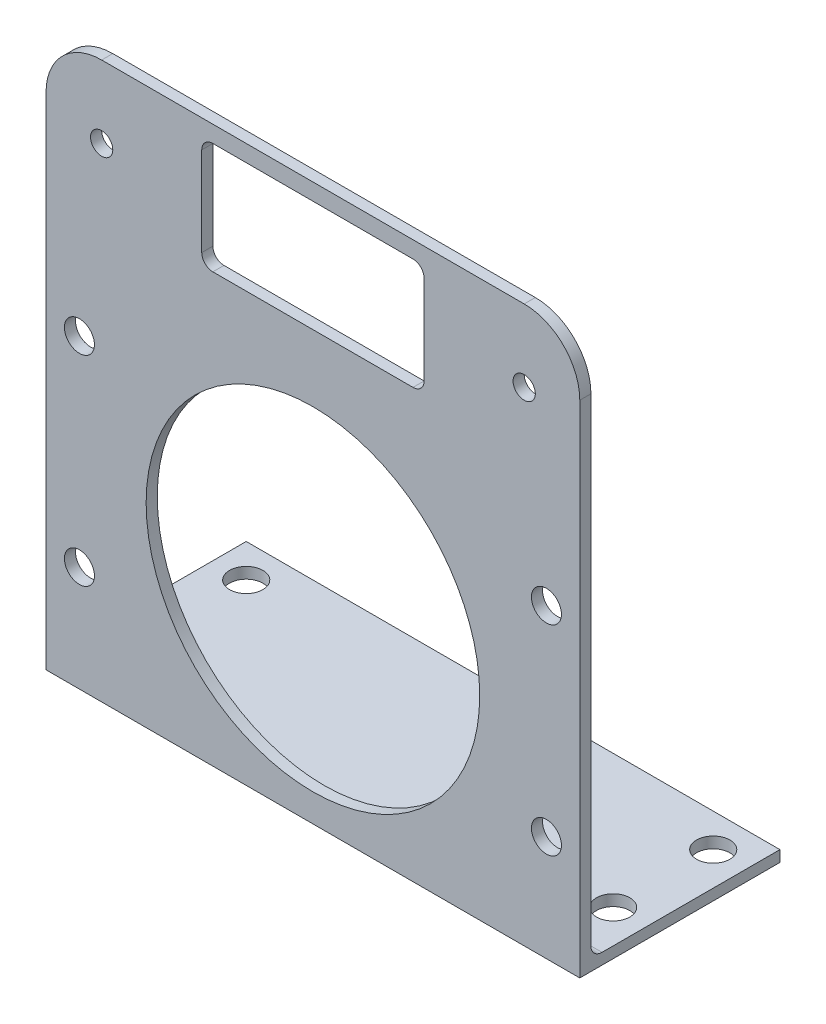
ISO-10303-21;
HEADER;
FILE_DESCRIPTION(('STEP AP214'),'2;1');
FILE_NAME('part.step','',(''),(''),'','','');
FILE_SCHEMA(('AUTOMOTIVE_DESIGN { 1 0 10303 214 1 1 1 1 }'));
ENDSEC;
DATA;
#1=APPLICATION_CONTEXT('core data for automotive mechanical design processes');
#2=APPLICATION_PROTOCOL_DEFINITION('international standard','automotive_design',2000,#1);
#3=PRODUCT_CONTEXT('',#1,'mechanical');
#4=PRODUCT('Part','Part','',(#3));
#5=PRODUCT_RELATED_PRODUCT_CATEGORY('part','',(#4));
#6=PRODUCT_DEFINITION_FORMATION('','',#4);
#7=PRODUCT_DEFINITION_CONTEXT('part definition',#1,'design');
#8=PRODUCT_DEFINITION('design','',#6,#7);
#9=PRODUCT_DEFINITION_SHAPE('','',#8);
#10=(LENGTH_UNIT() NAMED_UNIT(*) SI_UNIT(.MILLI.,.METRE.));
#11=(NAMED_UNIT(*) PLANE_ANGLE_UNIT() SI_UNIT($,.RADIAN.));
#12=(NAMED_UNIT(*) SI_UNIT($,.STERADIAN.) SOLID_ANGLE_UNIT());
#13=UNCERTAINTY_MEASURE_WITH_UNIT(LENGTH_MEASURE(1.E-05),#10,'distance_accuracy_value','');
#14=(GEOMETRIC_REPRESENTATION_CONTEXT(3) GLOBAL_UNCERTAINTY_ASSIGNED_CONTEXT((#13)) GLOBAL_UNIT_ASSIGNED_CONTEXT((#10,
#11,#12)) REPRESENTATION_CONTEXT('',''));
#15=CARTESIAN_POINT('',(0.,0.,0.));
#16=DIRECTION('',(0.,0.,1.));
#17=DIRECTION('',(1.,0.,0.));
#18=AXIS2_PLACEMENT_3D('',#15,#16,#17);
#19=CARTESIAN_POINT('',(0.,0.,0.));
#20=DIRECTION('',(0.,0.,1.));
#21=DIRECTION('',(1.,0.,0.));
#22=AXIS2_PLACEMENT_3D('',#19,#20,#21);
#23=PLANE('',#22);
#24=CARTESIAN_POINT('',(-19.,26.,0.));
#25=DIRECTION('',(0.,0.,1.));
#26=DIRECTION('',(1.,0.,0.));
#27=AXIS2_PLACEMENT_3D('',#24,#25,#26);
#28=CIRCLE('',#27,1.);
#29=CARTESIAN_POINT('',(-18.,26.,0.));
#30=VERTEX_POINT('',#29);
#31=EDGE_CURVE('E324',#30,#30,#28,.T.);
#32=ORIENTED_EDGE('',*,*,#31,.T.);
#33=EDGE_LOOP('',(#32));
#34=FACE_BOUND('',#33,.T.);
#35=CARTESIAN_POINT('',(19.,26.,0.));
#36=DIRECTION('',(0.,0.,1.));
#37=DIRECTION('',(1.,0.,0.));
#38=AXIS2_PLACEMENT_3D('',#35,#36,#37);
#39=CIRCLE('',#38,1.);
#40=CARTESIAN_POINT('',(20.,26.,0.));
#41=VERTEX_POINT('',#40);
#42=EDGE_CURVE('E507',#41,#41,#39,.T.);
#43=ORIENTED_EDGE('',*,*,#42,.T.);
#44=EDGE_LOOP('',(#43));
#45=FACE_BOUND('',#44,.T.);
#46=DIRECTION('',(0.,-1.,0.));
#47=VECTOR('',#46,1.);
#48=CARTESIAN_POINT('',(-10.,0.,0.));
#49=LINE('',#48,#47);
#50=CARTESIAN_POINT('',(-10.,30.,0.));
#51=VERTEX_POINT('',#50);
#52=CARTESIAN_POINT('',(-10.,22.,0.));
#53=VERTEX_POINT('',#52);
#54=EDGE_CURVE('E519',#51,#53,#49,.T.);
#55=ORIENTED_EDGE('',*,*,#54,.T.);
#56=CARTESIAN_POINT('',(-9.,22.,0.));
#57=DIRECTION('',(0.,0.,1.));
#58=DIRECTION('',(1.,0.,0.));
#59=AXIS2_PLACEMENT_3D('',#56,#57,#58);
#60=CIRCLE('',#59,1.);
#61=CARTESIAN_POINT('',(-9.,21.,0.));
#62=VERTEX_POINT('',#61);
#63=EDGE_CURVE('E285',#53,#62,#60,.T.);
#64=ORIENTED_EDGE('',*,*,#63,.T.);
#65=DIRECTION('',(1.,0.,0.));
#66=VECTOR('',#65,1.);
#67=CARTESIAN_POINT('',(0.,21.,0.));
#68=LINE('',#67,#66);
#69=CARTESIAN_POINT('',(9.,21.,0.));
#70=VERTEX_POINT('',#69);
#71=EDGE_CURVE('E515',#62,#70,#68,.T.);
#72=ORIENTED_EDGE('',*,*,#71,.T.);
#73=CARTESIAN_POINT('',(9.,22.,0.));
#74=DIRECTION('',(0.,0.,1.));
#75=DIRECTION('',(1.,0.,0.));
#76=AXIS2_PLACEMENT_3D('',#73,#74,#75);
#77=CIRCLE('',#76,1.);
#78=CARTESIAN_POINT('',(10.,22.,0.));
#79=VERTEX_POINT('',#78);
#80=EDGE_CURVE('E273',#70,#79,#77,.T.);
#81=ORIENTED_EDGE('',*,*,#80,.T.);
#82=DIRECTION('',(0.,1.,0.));
#83=VECTOR('',#82,1.);
#84=CARTESIAN_POINT('',(10.,0.,0.));
#85=LINE('',#84,#83);
#86=CARTESIAN_POINT('',(9.99999999999999,30.,0.));
#87=VERTEX_POINT('',#86);
#88=EDGE_CURVE('E511',#79,#87,#85,.T.);
#89=ORIENTED_EDGE('',*,*,#88,.T.);
#90=CARTESIAN_POINT('',(8.99999999999999,30.,0.));
#91=DIRECTION('',(0.,0.,1.));
#92=DIRECTION('',(1.,0.,0.));
#93=AXIS2_PLACEMENT_3D('',#90,#91,#92);
#94=CIRCLE('',#93,1.);
#95=CARTESIAN_POINT('',(8.99999999999999,31.,0.));
#96=VERTEX_POINT('',#95);
#97=EDGE_CURVE('E279',#87,#96,#94,.T.);
#98=ORIENTED_EDGE('',*,*,#97,.T.);
#99=DIRECTION('',(-1.,0.,0.));
#100=VECTOR('',#99,1.);
#101=CARTESIAN_POINT('',(0.,31.,0.));
#102=LINE('',#101,#100);
#103=CARTESIAN_POINT('',(-9.00000000000001,31.,0.));
#104=VERTEX_POINT('',#103);
#105=EDGE_CURVE('E523',#96,#104,#102,.T.);
#106=ORIENTED_EDGE('',*,*,#105,.T.);
#107=CARTESIAN_POINT('',(-9.00000000000001,30.,0.));
#108=DIRECTION('',(0.,0.,1.));
#109=DIRECTION('',(1.,0.,0.));
#110=AXIS2_PLACEMENT_3D('',#107,#108,#109);
#111=CIRCLE('',#110,1.);
#112=EDGE_CURVE('E291',#104,#51,#111,.T.);
#113=ORIENTED_EDGE('',*,*,#112,.T.);
#114=EDGE_LOOP('',(#55,#64,#72,#81,#89,#98,#106,#113));
#115=FACE_BOUND('',#114,.T.);
#116=CARTESIAN_POINT('',(-21.,-8.,0.));
#117=DIRECTION('',(0.,0.,1.));
#118=DIRECTION('',(1.,0.,0.));
#119=AXIS2_PLACEMENT_3D('',#116,#117,#118);
#120=CIRCLE('',#119,1.35);
#121=CARTESIAN_POINT('',(-19.65,-8.,0.));
#122=VERTEX_POINT('',#121);
#123=EDGE_CURVE('E194',#122,#122,#120,.T.);
#124=ORIENTED_EDGE('',*,*,#123,.T.);
#125=EDGE_LOOP('',(#124));
#126=FACE_BOUND('',#125,.T.);
#127=CARTESIAN_POINT('',(21.,-8.,0.));
#128=DIRECTION('',(0.,0.,1.));
#129=DIRECTION('',(1.,0.,0.));
#130=AXIS2_PLACEMENT_3D('',#127,#128,#129);
#131=CIRCLE('',#130,1.35);
#132=CARTESIAN_POINT('',(22.35,-8.,0.));
#133=VERTEX_POINT('',#132);
#134=EDGE_CURVE('E198',#133,#133,#131,.T.);
#135=ORIENTED_EDGE('',*,*,#134,.T.);
#136=EDGE_LOOP('',(#135));
#137=FACE_BOUND('',#136,.T.);
#138=CARTESIAN_POINT('',(21.,10.,0.));
#139=DIRECTION('',(0.,0.,1.));
#140=DIRECTION('',(1.,0.,0.));
#141=AXIS2_PLACEMENT_3D('',#138,#139,#140);
#142=CIRCLE('',#141,1.35);
#143=CARTESIAN_POINT('',(22.35,10.,0.));
#144=VERTEX_POINT('',#143);
#145=EDGE_CURVE('E469',#144,#144,#142,.T.);
#146=ORIENTED_EDGE('',*,*,#145,.T.);
#147=EDGE_LOOP('',(#146));
#148=FACE_BOUND('',#147,.T.);
#149=CARTESIAN_POINT('',(0.,0.,0.));
#150=DIRECTION('',(0.,0.,1.));
#151=DIRECTION('',(1.,0.,0.));
#152=AXIS2_PLACEMENT_3D('',#149,#150,#151);
#153=CIRCLE('',#152,15.);
#154=CARTESIAN_POINT('',(15.,0.,0.));
#155=VERTEX_POINT('',#154);
#156=EDGE_CURVE('E464',#155,#155,#153,.T.);
#157=ORIENTED_EDGE('',*,*,#156,.T.);
#158=EDGE_LOOP('',(#157));
#159=FACE_BOUND('',#158,.T.);
#160=CARTESIAN_POINT('',(-21.,10.,0.));
#161=DIRECTION('',(0.,0.,1.));
#162=DIRECTION('',(1.,0.,0.));
#163=AXIS2_PLACEMENT_3D('',#160,#161,#162);
#164=CIRCLE('',#163,1.35);
#165=CARTESIAN_POINT('',(-19.65,10.,0.));
#166=VERTEX_POINT('',#165);
#167=EDGE_CURVE('E461',#166,#166,#164,.T.);
#168=ORIENTED_EDGE('',*,*,#167,.T.);
#169=EDGE_LOOP('',(#168));
#170=FACE_BOUND('',#169,.T.);
#171=DIRECTION('',(0.,-1.,0.));
#172=VECTOR('',#171,1.);
#173=CARTESIAN_POINT('',(-24.,17.5,0.));
#174=LINE('',#173,#172);
#175=CARTESIAN_POINT('',(-24.,27.5,0.));
#176=VERTEX_POINT('',#175);
#177=CARTESIAN_POINT('',(-24.,-15.5,0.));
#178=VERTEX_POINT('',#177);
#179=EDGE_CURVE('E217',#176,#178,#174,.T.);
#180=ORIENTED_EDGE('',*,*,#179,.F.);
#181=CARTESIAN_POINT('',(-19.,27.5,0.));
#182=DIRECTION('',(0.,0.,1.));
#183=DIRECTION('',(1.,0.,0.));
#184=AXIS2_PLACEMENT_3D('',#181,#182,#183);
#185=CIRCLE('',#184,5.);
#186=CARTESIAN_POINT('',(-19.,32.5,0.));
#187=VERTEX_POINT('',#186);
#188=EDGE_CURVE('E53',#176,#187,#185,.F.);
#189=ORIENTED_EDGE('',*,*,#188,.T.);
#190=DIRECTION('',(-1.,0.,0.));
#191=VECTOR('',#190,1.);
#192=CARTESIAN_POINT('',(24.,32.5,0.));
#193=LINE('',#192,#191);
#194=CARTESIAN_POINT('',(19.,32.5,0.));
#195=VERTEX_POINT('',#194);
#196=EDGE_CURVE('E314',#195,#187,#193,.T.);
#197=ORIENTED_EDGE('',*,*,#196,.F.);
#198=CARTESIAN_POINT('',(19.,27.5,0.));
#199=DIRECTION('',(0.,0.,1.));
#200=DIRECTION('',(1.,0.,0.));
#201=AXIS2_PLACEMENT_3D('',#198,#199,#200);
#202=CIRCLE('',#201,5.);
#203=CARTESIAN_POINT('',(24.,27.5,0.));
#204=VERTEX_POINT('',#203);
#205=EDGE_CURVE('E60',#195,#204,#202,.F.);
#206=ORIENTED_EDGE('',*,*,#205,.T.);
#207=DIRECTION('',(0.,1.,0.));
#208=VECTOR('',#207,1.);
#209=CARTESIAN_POINT('',(24.,17.5,0.));
#210=LINE('',#209,#208);
#211=CARTESIAN_POINT('',(24.,-15.5,0.));
#212=VERTEX_POINT('',#211);
#213=EDGE_CURVE('E213',#212,#204,#210,.T.);
#214=ORIENTED_EDGE('',*,*,#213,.F.);
#215=DIRECTION('',(1.,0.,0.));
#216=VECTOR('',#215,1.);
#217=CARTESIAN_POINT('',(-24.,-15.5,0.));
#218=LINE('',#217,#216);
#219=EDGE_CURVE('E232',#212,#178,#218,.F.);
#220=ORIENTED_EDGE('',*,*,#219,.T.);
#221=EDGE_LOOP('',(#180,#189,#197,#206,#214,#220));
#222=FACE_BOUND('',#221,.T.);
#223=ADVANCED_FACE('F44',(#34,#45,#115,#126,#137,#148,#159,#170,#222),#23,.F.);
#224=CARTESIAN_POINT('',(24.,17.5,1.));
#225=DIRECTION('',(-1.,0.,0.));
#226=DIRECTION('',(0.,-1.,0.));
#227=AXIS2_PLACEMENT_3D('',#224,#225,#226);
#228=PLANE('',#227);
#229=ORIENTED_EDGE('',*,*,#213,.T.);
#230=DIRECTION('',(0.,0.,-1.));
#231=VECTOR('',#230,1.);
#232=CARTESIAN_POINT('',(24.,27.5,1.));
#233=LINE('',#232,#231);
#234=CARTESIAN_POINT('',(24.,27.5,1.));
#235=VERTEX_POINT('',#234);
#236=EDGE_CURVE('E11',#204,#235,#233,.F.);
#237=ORIENTED_EDGE('',*,*,#236,.T.);
#238=DIRECTION('',(0.,1.,0.));
#239=VECTOR('',#238,1.);
#240=CARTESIAN_POINT('',(24.,17.5,1.));
#241=LINE('',#240,#239);
#242=CARTESIAN_POINT('',(24.,-17.5,1.));
#243=VERTEX_POINT('',#242);
#244=EDGE_CURVE('E173',#243,#235,#241,.T.);
#245=ORIENTED_EDGE('',*,*,#244,.F.);
#246=DIRECTION('',(0.,0.,-1.));
#247=VECTOR('',#246,1.);
#248=CARTESIAN_POINT('',(24.,-17.5,1.));
#249=LINE('',#248,#247);
#250=CARTESIAN_POINT('',(24.,-17.5,-17.));
#251=VERTEX_POINT('',#250);
#252=EDGE_CURVE('E166',#243,#251,#249,.T.);
#253=ORIENTED_EDGE('',*,*,#252,.T.);
#254=DIRECTION('',(0.,-1.,0.));
#255=VECTOR('',#254,1.);
#256=CARTESIAN_POINT('',(24.,-17.5,-17.));
#257=LINE('',#256,#255);
#258=CARTESIAN_POINT('',(24.,-16.5,-17.));
#259=VERTEX_POINT('',#258);
#260=EDGE_CURVE('E171',#259,#251,#257,.T.);
#261=ORIENTED_EDGE('',*,*,#260,.F.);
#262=DIRECTION('',(0.,0.,1.));
#263=VECTOR('',#262,1.);
#264=CARTESIAN_POINT('',(24.,-16.5,-17.));
#265=LINE('',#264,#263);
#266=CARTESIAN_POINT('',(24.,-16.5,-1.));
#267=VERTEX_POINT('',#266);
#268=EDGE_CURVE('E206',#259,#267,#265,.T.);
#269=ORIENTED_EDGE('',*,*,#268,.T.);
#270=CARTESIAN_POINT('',(24.,-15.5,-1.));
#271=DIRECTION('',(-1.,0.,0.));
#272=DIRECTION('',(0.,-1.,0.));
#273=AXIS2_PLACEMENT_3D('',#270,#271,#272);
#274=CIRCLE('',#273,1.);
#275=EDGE_CURVE('E236',#267,#212,#274,.T.);
#276=ORIENTED_EDGE('',*,*,#275,.T.);
#277=EDGE_LOOP('',(#229,#237,#245,#253,#261,#269,#276));
#278=FACE_BOUND('',#277,.T.);
#279=ADVANCED_FACE('F168',(#278),#228,.F.);
#280=CARTESIAN_POINT('',(-24.,17.5,1.));
#281=DIRECTION('',(1.,0.,0.));
#282=DIRECTION('',(0.,1.,0.));
#283=AXIS2_PLACEMENT_3D('',#280,#281,#282);
#284=PLANE('',#283);
#285=DIRECTION('',(0.,-1.,0.));
#286=VECTOR('',#285,1.);
#287=CARTESIAN_POINT('',(-24.,17.5,1.));
#288=LINE('',#287,#286);
#289=CARTESIAN_POINT('',(-24.,27.5,1.));
#290=VERTEX_POINT('',#289);
#291=CARTESIAN_POINT('',(-24.,-17.5,1.));
#292=VERTEX_POINT('',#291);
#293=EDGE_CURVE('E216',#290,#292,#288,.T.);
#294=ORIENTED_EDGE('',*,*,#293,.F.);
#295=DIRECTION('',(0.,0.,1.));
#296=VECTOR('',#295,1.);
#297=CARTESIAN_POINT('',(-24.,27.5,0.));
#298=LINE('',#297,#296);
#299=EDGE_CURVE('E68',#290,#176,#298,.F.);
#300=ORIENTED_EDGE('',*,*,#299,.T.);
#301=ORIENTED_EDGE('',*,*,#179,.T.);
#302=CARTESIAN_POINT('',(-24.,-15.5,-1.));
#303=DIRECTION('',(1.,0.,0.));
#304=DIRECTION('',(0.,1.,0.));
#305=AXIS2_PLACEMENT_3D('',#302,#303,#304);
#306=CIRCLE('',#305,1.);
#307=CARTESIAN_POINT('',(-24.,-16.5,-1.));
#308=VERTEX_POINT('',#307);
#309=EDGE_CURVE('E239',#178,#308,#306,.T.);
#310=ORIENTED_EDGE('',*,*,#309,.T.);
#311=DIRECTION('',(0.,0.,1.));
#312=VECTOR('',#311,1.);
#313=CARTESIAN_POINT('',(-24.,-16.5,-17.));
#314=LINE('',#313,#312);
#315=CARTESIAN_POINT('',(-24.,-16.5,-17.));
#316=VERTEX_POINT('',#315);
#317=EDGE_CURVE('E209',#316,#308,#314,.T.);
#318=ORIENTED_EDGE('',*,*,#317,.F.);
#319=DIRECTION('',(0.,1.,0.));
#320=VECTOR('',#319,1.);
#321=CARTESIAN_POINT('',(-24.,-17.5,-17.));
#322=LINE('',#321,#320);
#323=CARTESIAN_POINT('',(-24.,-17.5,-17.));
#324=VERTEX_POINT('',#323);
#325=EDGE_CURVE('E187',#324,#316,#322,.T.);
#326=ORIENTED_EDGE('',*,*,#325,.F.);
#327=DIRECTION('',(0.,0.,-1.));
#328=VECTOR('',#327,1.);
#329=CARTESIAN_POINT('',(-24.,-17.5,1.));
#330=LINE('',#329,#328);
#331=EDGE_CURVE('E177',#292,#324,#330,.T.);
#332=ORIENTED_EDGE('',*,*,#331,.F.);
#333=EDGE_LOOP('',(#294,#300,#301,#310,#318,#326,#332));
#334=FACE_BOUND('',#333,.T.);
#335=ADVANCED_FACE('F329',(#334),#284,.F.);
#336=CARTESIAN_POINT('',(-24.,-17.5,1.));
#337=DIRECTION('',(0.,1.,0.));
#338=DIRECTION('',(0.,0.,1.));
#339=AXIS2_PLACEMENT_3D('',#336,#337,#338);
#340=PLANE('',#339);
#341=CARTESIAN_POINT('',(21.,-17.5,-14.));
#342=DIRECTION('',(0.,1.,0.));
#343=DIRECTION('',(0.,0.,1.));
#344=AXIS2_PLACEMENT_3D('',#341,#342,#343);
#345=CIRCLE('',#344,1.5);
#346=CARTESIAN_POINT('',(21.,-17.5,-12.5));
#347=VERTEX_POINT('',#346);
#348=EDGE_CURVE('E569',#347,#347,#345,.T.);
#349=ORIENTED_EDGE('',*,*,#348,.T.);
#350=EDGE_LOOP('',(#349));
#351=FACE_BOUND('',#350,.T.);
#352=CARTESIAN_POINT('',(-21.,-17.5,-4.99999999999999));
#353=DIRECTION('',(0.,1.,0.));
#354=DIRECTION('',(0.,0.,-1.));
#355=AXIS2_PLACEMENT_3D('',#352,#353,#354);
#356=CIRCLE('',#355,1.5);
#357=CARTESIAN_POINT('',(-21.,-17.5,-6.49999999999999));
#358=VERTEX_POINT('',#357);
#359=EDGE_CURVE('E560',#358,#358,#356,.T.);
#360=ORIENTED_EDGE('',*,*,#359,.T.);
#361=EDGE_LOOP('',(#360));
#362=FACE_BOUND('',#361,.T.);
#363=CARTESIAN_POINT('',(-21.,-17.5,-14.));
#364=DIRECTION('',(0.,1.,0.));
#365=DIRECTION('',(0.,0.,-1.));
#366=AXIS2_PLACEMENT_3D('',#363,#364,#365);
#367=CIRCLE('',#366,1.5);
#368=CARTESIAN_POINT('',(-21.,-17.5,-15.5));
#369=VERTEX_POINT('',#368);
#370=EDGE_CURVE('E576',#369,#369,#367,.T.);
#371=ORIENTED_EDGE('',*,*,#370,.T.);
#372=EDGE_LOOP('',(#371));
#373=FACE_BOUND('',#372,.T.);
#374=CARTESIAN_POINT('',(21.,-17.5,-5.));
#375=DIRECTION('',(0.,1.,0.));
#376=DIRECTION('',(0.,0.,1.));
#377=AXIS2_PLACEMENT_3D('',#374,#375,#376);
#378=CIRCLE('',#377,1.5);
#379=CARTESIAN_POINT('',(21.,-17.5,-3.5));
#380=VERTEX_POINT('',#379);
#381=EDGE_CURVE('E545',#380,#380,#378,.T.);
#382=ORIENTED_EDGE('',*,*,#381,.T.);
#383=EDGE_LOOP('',(#382));
#384=FACE_BOUND('',#383,.T.);
#385=ORIENTED_EDGE('',*,*,#331,.T.);
#386=DIRECTION('',(-1.,0.,0.));
#387=VECTOR('',#386,1.);
#388=CARTESIAN_POINT('',(24.,-17.5,-17.));
#389=LINE('',#388,#387);
#390=EDGE_CURVE('E181',#251,#324,#389,.T.);
#391=ORIENTED_EDGE('',*,*,#390,.F.);
#392=ORIENTED_EDGE('',*,*,#252,.F.);
#393=DIRECTION('',(1.,0.,0.));
#394=VECTOR('',#393,1.);
#395=CARTESIAN_POINT('',(-24.,-17.5,1.));
#396=LINE('',#395,#394);
#397=EDGE_CURVE('E178',#292,#243,#396,.T.);
#398=ORIENTED_EDGE('',*,*,#397,.F.);
#399=EDGE_LOOP('',(#385,#391,#392,#398));
#400=FACE_BOUND('',#399,.T.);
#401=ADVANCED_FACE('F182',(#351,#362,#373,#384,#400),#340,.F.);
#402=CARTESIAN_POINT('',(0.,0.,1.));
#403=DIRECTION('',(0.,0.,1.));
#404=DIRECTION('',(1.,0.,0.));
#405=AXIS2_PLACEMENT_3D('',#402,#403,#404);
#406=PLANE('',#405);
#407=CARTESIAN_POINT('',(-19.,26.,1.));
#408=DIRECTION('',(0.,0.,1.));
#409=DIRECTION('',(1.,0.,0.));
#410=AXIS2_PLACEMENT_3D('',#407,#408,#409);
#411=CIRCLE('',#410,1.);
#412=CARTESIAN_POINT('',(-18.,26.,1.));
#413=VERTEX_POINT('',#412);
#414=EDGE_CURVE('E527',#413,#413,#411,.T.);
#415=ORIENTED_EDGE('',*,*,#414,.F.);
#416=EDGE_LOOP('',(#415));
#417=FACE_BOUND('',#416,.T.);
#418=CARTESIAN_POINT('',(19.,26.,1.));
#419=DIRECTION('',(0.,0.,1.));
#420=DIRECTION('',(1.,0.,0.));
#421=AXIS2_PLACEMENT_3D('',#418,#419,#420);
#422=CIRCLE('',#421,1.);
#423=CARTESIAN_POINT('',(20.,26.,1.));
#424=VERTEX_POINT('',#423);
#425=EDGE_CURVE('E532',#424,#424,#422,.T.);
#426=ORIENTED_EDGE('',*,*,#425,.F.);
#427=EDGE_LOOP('',(#426));
#428=FACE_BOUND('',#427,.T.);
#429=DIRECTION('',(0.,1.,0.));
#430=VECTOR('',#429,1.);
#431=CARTESIAN_POINT('',(9.99999999999999,31.,1.));
#432=LINE('',#431,#430);
#433=CARTESIAN_POINT('',(10.,22.,1.));
#434=VERTEX_POINT('',#433);
#435=CARTESIAN_POINT('',(9.99999999999999,30.,1.));
#436=VERTEX_POINT('',#435);
#437=EDGE_CURVE('E528',#434,#436,#432,.T.);
#438=ORIENTED_EDGE('',*,*,#437,.F.);
#439=CARTESIAN_POINT('',(9.,22.,1.));
#440=DIRECTION('',(0.,0.,1.));
#441=DIRECTION('',(1.,0.,0.));
#442=AXIS2_PLACEMENT_3D('',#439,#440,#441);
#443=CIRCLE('',#442,1.);
#444=CARTESIAN_POINT('',(9.,21.,1.));
#445=VERTEX_POINT('',#444);
#446=EDGE_CURVE('E270',#434,#445,#443,.F.);
#447=ORIENTED_EDGE('',*,*,#446,.T.);
#448=DIRECTION('',(1.,0.,0.));
#449=VECTOR('',#448,1.);
#450=CARTESIAN_POINT('',(-10.,21.,1.));
#451=LINE('',#450,#449);
#452=CARTESIAN_POINT('',(-9.,21.,1.));
#453=VERTEX_POINT('',#452);
#454=EDGE_CURVE('E541',#453,#445,#451,.T.);
#455=ORIENTED_EDGE('',*,*,#454,.F.);
#456=CARTESIAN_POINT('',(-9.,22.,1.));
#457=DIRECTION('',(0.,0.,1.));
#458=DIRECTION('',(1.,0.,0.));
#459=AXIS2_PLACEMENT_3D('',#456,#457,#458);
#460=CIRCLE('',#459,1.);
#461=CARTESIAN_POINT('',(-10.,22.,1.));
#462=VERTEX_POINT('',#461);
#463=EDGE_CURVE('E282',#453,#462,#460,.F.);
#464=ORIENTED_EDGE('',*,*,#463,.T.);
#465=DIRECTION('',(0.,-1.,0.));
#466=VECTOR('',#465,1.);
#467=CARTESIAN_POINT('',(-10.,31.,1.));
#468=LINE('',#467,#466);
#469=CARTESIAN_POINT('',(-10.,30.,1.));
#470=VERTEX_POINT('',#469);
#471=EDGE_CURVE('E537',#470,#462,#468,.T.);
#472=ORIENTED_EDGE('',*,*,#471,.F.);
#473=CARTESIAN_POINT('',(-9.00000000000001,30.,1.));
#474=DIRECTION('',(0.,0.,1.));
#475=DIRECTION('',(1.,0.,0.));
#476=AXIS2_PLACEMENT_3D('',#473,#474,#475);
#477=CIRCLE('',#476,1.);
#478=CARTESIAN_POINT('',(-9.00000000000001,31.,1.));
#479=VERTEX_POINT('',#478);
#480=EDGE_CURVE('E288',#470,#479,#477,.F.);
#481=ORIENTED_EDGE('',*,*,#480,.T.);
#482=DIRECTION('',(-1.,0.,0.));
#483=VECTOR('',#482,1.);
#484=CARTESIAN_POINT('',(-10.,31.,1.));
#485=LINE('',#484,#483);
#486=CARTESIAN_POINT('',(8.99999999999999,31.,1.));
#487=VERTEX_POINT('',#486);
#488=EDGE_CURVE('E533',#487,#479,#485,.T.);
#489=ORIENTED_EDGE('',*,*,#488,.F.);
#490=CARTESIAN_POINT('',(8.99999999999999,30.,1.));
#491=DIRECTION('',(0.,0.,1.));
#492=DIRECTION('',(1.,0.,0.));
#493=AXIS2_PLACEMENT_3D('',#490,#491,#492);
#494=CIRCLE('',#493,1.);
#495=EDGE_CURVE('E276',#487,#436,#494,.F.);
#496=ORIENTED_EDGE('',*,*,#495,.T.);
#497=EDGE_LOOP('',(#438,#447,#455,#464,#472,#481,#489,#496));
#498=FACE_BOUND('',#497,.T.);
#499=CARTESIAN_POINT('',(-21.,-8.,1.));
#500=DIRECTION('',(0.,0.,1.));
#501=DIRECTION('',(1.,0.,0.));
#502=AXIS2_PLACEMENT_3D('',#499,#500,#501);
#503=CIRCLE('',#502,1.35);
#504=CARTESIAN_POINT('',(-19.65,-8.,1.));
#505=VERTEX_POINT('',#504);
#506=EDGE_CURVE('E471',#505,#505,#503,.T.);
#507=ORIENTED_EDGE('',*,*,#506,.F.);
#508=EDGE_LOOP('',(#507));
#509=FACE_BOUND('',#508,.T.);
#510=CARTESIAN_POINT('',(21.,-8.,1.));
#511=DIRECTION('',(0.,0.,1.));
#512=DIRECTION('',(-1.,0.,0.));
#513=AXIS2_PLACEMENT_3D('',#510,#511,#512);
#514=CIRCLE('',#513,1.35);
#515=CARTESIAN_POINT('',(19.65,-8.,1.));
#516=VERTEX_POINT('',#515);
#517=EDGE_CURVE('E488',#516,#516,#514,.T.);
#518=ORIENTED_EDGE('',*,*,#517,.F.);
#519=EDGE_LOOP('',(#518));
#520=FACE_BOUND('',#519,.T.);
#521=CARTESIAN_POINT('',(21.,10.,1.));
#522=DIRECTION('',(0.,0.,1.));
#523=DIRECTION('',(-1.,0.,0.));
#524=AXIS2_PLACEMENT_3D('',#521,#522,#523);
#525=CIRCLE('',#524,1.35);
#526=CARTESIAN_POINT('',(19.65,10.,1.));
#527=VERTEX_POINT('',#526);
#528=EDGE_CURVE('E492',#527,#527,#525,.T.);
#529=ORIENTED_EDGE('',*,*,#528,.F.);
#530=EDGE_LOOP('',(#529));
#531=FACE_BOUND('',#530,.T.);
#532=CARTESIAN_POINT('',(0.,0.,1.));
#533=DIRECTION('',(0.,0.,1.));
#534=DIRECTION('',(1.,0.,0.));
#535=AXIS2_PLACEMENT_3D('',#532,#533,#534);
#536=CIRCLE('',#535,15.);
#537=CARTESIAN_POINT('',(15.,0.,1.));
#538=VERTEX_POINT('',#537);
#539=EDGE_CURVE('E496',#538,#538,#536,.T.);
#540=ORIENTED_EDGE('',*,*,#539,.F.);
#541=EDGE_LOOP('',(#540));
#542=FACE_BOUND('',#541,.T.);
#543=CARTESIAN_POINT('',(-21.,10.,1.));
#544=DIRECTION('',(0.,0.,1.));
#545=DIRECTION('',(1.,0.,0.));
#546=AXIS2_PLACEMENT_3D('',#543,#544,#545);
#547=CIRCLE('',#546,1.35);
#548=CARTESIAN_POINT('',(-19.65,10.,1.));
#549=VERTEX_POINT('',#548);
#550=EDGE_CURVE('E458',#549,#549,#547,.T.);
#551=ORIENTED_EDGE('',*,*,#550,.F.);
#552=EDGE_LOOP('',(#551));
#553=FACE_BOUND('',#552,.T.);
#554=DIRECTION('',(1.,0.,0.));
#555=VECTOR('',#554,1.);
#556=CARTESIAN_POINT('',(24.,32.5,1.));
#557=LINE('',#556,#555);
#558=CARTESIAN_POINT('',(-19.,32.5,1.));
#559=VERTEX_POINT('',#558);
#560=CARTESIAN_POINT('',(19.,32.5,1.));
#561=VERTEX_POINT('',#560);
#562=EDGE_CURVE('E323',#559,#561,#557,.T.);
#563=ORIENTED_EDGE('',*,*,#562,.F.);
#564=CARTESIAN_POINT('',(-19.,27.5,1.));
#565=DIRECTION('',(0.,0.,1.));
#566=DIRECTION('',(1.,0.,0.));
#567=AXIS2_PLACEMENT_3D('',#564,#565,#566);
#568=CIRCLE('',#567,5.);
#569=EDGE_CURVE('E305',#559,#290,#568,.T.);
#570=ORIENTED_EDGE('',*,*,#569,.T.);
#571=ORIENTED_EDGE('',*,*,#293,.T.);
#572=ORIENTED_EDGE('',*,*,#397,.T.);
#573=ORIENTED_EDGE('',*,*,#244,.T.);
#574=CARTESIAN_POINT('',(19.,27.5,1.));
#575=DIRECTION('',(0.,0.,1.));
#576=DIRECTION('',(1.,0.,0.));
#577=AXIS2_PLACEMENT_3D('',#574,#575,#576);
#578=CIRCLE('',#577,5.);
#579=EDGE_CURVE('E302',#235,#561,#578,.T.);
#580=ORIENTED_EDGE('',*,*,#579,.T.);
#581=EDGE_LOOP('',(#563,#570,#571,#572,#573,#580));
#582=FACE_BOUND('',#581,.T.);
#583=ADVANCED_FACE('F328',(#417,#428,#498,#509,#520,#531,#542,#553,#582),#406,.T.);
#584=CARTESIAN_POINT('',(24.,-16.5,-17.));
#585=DIRECTION('',(0.,-1.,0.));
#586=DIRECTION('',(0.,0.,-1.));
#587=AXIS2_PLACEMENT_3D('',#584,#585,#586);
#588=PLANE('',#587);
#589=CARTESIAN_POINT('',(21.,-16.5,-14.));
#590=DIRECTION('',(0.,1.,0.));
#591=DIRECTION('',(0.,0.,1.));
#592=AXIS2_PLACEMENT_3D('',#589,#590,#591);
#593=CIRCLE('',#592,1.5);
#594=CARTESIAN_POINT('',(21.,-16.5,-12.5));
#595=VERTEX_POINT('',#594);
#596=EDGE_CURVE('E556',#595,#595,#593,.T.);
#597=ORIENTED_EDGE('',*,*,#596,.F.);
#598=EDGE_LOOP('',(#597));
#599=FACE_BOUND('',#598,.T.);
#600=CARTESIAN_POINT('',(-21.,-16.5,-4.99999999999999));
#601=DIRECTION('',(0.,1.,0.));
#602=DIRECTION('',(0.,0.,-1.));
#603=AXIS2_PLACEMENT_3D('',#600,#601,#602);
#604=CIRCLE('',#603,1.5);
#605=CARTESIAN_POINT('',(-21.,-16.5,-6.49999999999999));
#606=VERTEX_POINT('',#605);
#607=EDGE_CURVE('E564',#606,#606,#604,.T.);
#608=ORIENTED_EDGE('',*,*,#607,.F.);
#609=EDGE_LOOP('',(#608));
#610=FACE_BOUND('',#609,.T.);
#611=CARTESIAN_POINT('',(-21.,-16.5,-14.));
#612=DIRECTION('',(0.,1.,0.));
#613=DIRECTION('',(0.,0.,-1.));
#614=AXIS2_PLACEMENT_3D('',#611,#612,#613);
#615=CIRCLE('',#614,1.5);
#616=CARTESIAN_POINT('',(-21.,-16.5,-15.5));
#617=VERTEX_POINT('',#616);
#618=EDGE_CURVE('E565',#617,#617,#615,.T.);
#619=ORIENTED_EDGE('',*,*,#618,.F.);
#620=EDGE_LOOP('',(#619));
#621=FACE_BOUND('',#620,.T.);
#622=CARTESIAN_POINT('',(21.,-16.5,-5.));
#623=DIRECTION('',(0.,1.,0.));
#624=DIRECTION('',(0.,0.,1.));
#625=AXIS2_PLACEMENT_3D('',#622,#623,#624);
#626=CIRCLE('',#625,1.5);
#627=CARTESIAN_POINT('',(21.,-16.5,-3.5));
#628=VERTEX_POINT('',#627);
#629=EDGE_CURVE('E552',#628,#628,#626,.T.);
#630=ORIENTED_EDGE('',*,*,#629,.F.);
#631=EDGE_LOOP('',(#630));
#632=FACE_BOUND('',#631,.T.);
#633=ORIENTED_EDGE('',*,*,#317,.T.);
#634=DIRECTION('',(1.,0.,0.));
#635=VECTOR('',#634,1.);
#636=CARTESIAN_POINT('',(24.,-16.5,-1.));
#637=LINE('',#636,#635);
#638=EDGE_CURVE('E228',#308,#267,#637,.T.);
#639=ORIENTED_EDGE('',*,*,#638,.T.);
#640=ORIENTED_EDGE('',*,*,#268,.F.);
#641=DIRECTION('',(1.,0.,0.));
#642=VECTOR('',#641,1.);
#643=CARTESIAN_POINT('',(24.,-16.5,-17.));
#644=LINE('',#643,#642);
#645=EDGE_CURVE('E191',#316,#259,#644,.T.);
#646=ORIENTED_EDGE('',*,*,#645,.F.);
#647=EDGE_LOOP('',(#633,#639,#640,#646));
#648=FACE_BOUND('',#647,.T.);
#649=ADVANCED_FACE('F340',(#599,#610,#621,#632,#648),#588,.F.);
#650=CARTESIAN_POINT('',(0.,0.,-17.));
#651=DIRECTION('',(0.,0.,1.));
#652=DIRECTION('',(1.,0.,0.));
#653=AXIS2_PLACEMENT_3D('',#650,#651,#652);
#654=PLANE('',#653);
#655=ORIENTED_EDGE('',*,*,#260,.T.);
#656=ORIENTED_EDGE('',*,*,#390,.T.);
#657=ORIENTED_EDGE('',*,*,#325,.T.);
#658=ORIENTED_EDGE('',*,*,#645,.T.);
#659=EDGE_LOOP('',(#655,#656,#657,#658));
#660=FACE_BOUND('',#659,.T.);
#661=ADVANCED_FACE('F189',(#660),#654,.F.);
#662=CARTESIAN_POINT('',(24.,-15.5,-1.));
#663=DIRECTION('',(-1.,0.,0.));
#664=DIRECTION('',(0.,0.,1.));
#665=AXIS2_PLACEMENT_3D('',#662,#663,#664);
#666=CYLINDRICAL_SURFACE('',#665,1.);
#667=ORIENTED_EDGE('',*,*,#309,.F.);
#668=ORIENTED_EDGE('',*,*,#219,.F.);
#669=ORIENTED_EDGE('',*,*,#275,.F.);
#670=ORIENTED_EDGE('',*,*,#638,.F.);
#671=EDGE_LOOP('',(#667,#668,#669,#670));
#672=FACE_BOUND('',#671,.T.);
#673=ADVANCED_FACE('F337',(#672),#666,.F.);
#674=CARTESIAN_POINT('',(-21.,10.,-17.));
#675=DIRECTION('',(0.,0.,1.));
#676=DIRECTION('',(1.,0.,0.));
#677=AXIS2_PLACEMENT_3D('',#674,#675,#676);
#678=CYLINDRICAL_SURFACE('',#677,1.35);
#679=ORIENTED_EDGE('',*,*,#550,.T.);
#680=EDGE_LOOP('',(#679));
#681=FACE_BOUND('',#680,.T.);
#682=ORIENTED_EDGE('',*,*,#167,.F.);
#683=EDGE_LOOP('',(#682));
#684=FACE_BOUND('',#683,.T.);
#685=ADVANCED_FACE('F372',(#681,#684),#678,.F.);
#686=CARTESIAN_POINT('',(0.,0.,-17.));
#687=DIRECTION('',(0.,0.,1.));
#688=DIRECTION('',(1.,0.,0.));
#689=AXIS2_PLACEMENT_3D('',#686,#687,#688);
#690=CYLINDRICAL_SURFACE('',#689,15.);
#691=ORIENTED_EDGE('',*,*,#539,.T.);
#692=EDGE_LOOP('',(#691));
#693=FACE_BOUND('',#692,.T.);
#694=ORIENTED_EDGE('',*,*,#156,.F.);
#695=EDGE_LOOP('',(#694));
#696=FACE_BOUND('',#695,.T.);
#697=ADVANCED_FACE('F440',(#693,#696),#690,.F.);
#698=CARTESIAN_POINT('',(21.,10.,-17.));
#699=DIRECTION('',(0.,0.,1.));
#700=DIRECTION('',(1.,0.,0.));
#701=AXIS2_PLACEMENT_3D('',#698,#699,#700);
#702=CYLINDRICAL_SURFACE('',#701,1.35);
#703=ORIENTED_EDGE('',*,*,#528,.T.);
#704=EDGE_LOOP('',(#703));
#705=FACE_BOUND('',#704,.T.);
#706=ORIENTED_EDGE('',*,*,#145,.F.);
#707=EDGE_LOOP('',(#706));
#708=FACE_BOUND('',#707,.T.);
#709=ADVANCED_FACE('F436',(#705,#708),#702,.F.);
#710=CARTESIAN_POINT('',(21.,-8.,-17.));
#711=DIRECTION('',(0.,0.,1.));
#712=DIRECTION('',(1.,0.,0.));
#713=AXIS2_PLACEMENT_3D('',#710,#711,#712);
#714=CYLINDRICAL_SURFACE('',#713,1.35);
#715=ORIENTED_EDGE('',*,*,#517,.T.);
#716=EDGE_LOOP('',(#715));
#717=FACE_BOUND('',#716,.T.);
#718=ORIENTED_EDGE('',*,*,#134,.F.);
#719=EDGE_LOOP('',(#718));
#720=FACE_BOUND('',#719,.T.);
#721=ADVANCED_FACE('F439',(#717,#720),#714,.F.);
#722=CARTESIAN_POINT('',(-21.,-8.,-17.));
#723=DIRECTION('',(0.,0.,1.));
#724=DIRECTION('',(1.,0.,0.));
#725=AXIS2_PLACEMENT_3D('',#722,#723,#724);
#726=CYLINDRICAL_SURFACE('',#725,1.35);
#727=ORIENTED_EDGE('',*,*,#506,.T.);
#728=EDGE_LOOP('',(#727));
#729=FACE_BOUND('',#728,.T.);
#730=ORIENTED_EDGE('',*,*,#123,.F.);
#731=EDGE_LOOP('',(#730));
#732=FACE_BOUND('',#731,.T.);
#733=ADVANCED_FACE('F435',(#729,#732),#726,.F.);
#734=CARTESIAN_POINT('',(0.,32.5,0.));
#735=DIRECTION('',(0.,1.,0.));
#736=DIRECTION('',(0.,0.,1.));
#737=AXIS2_PLACEMENT_3D('',#734,#735,#736);
#738=PLANE('',#737);
#739=ORIENTED_EDGE('',*,*,#196,.T.);
#740=DIRECTION('',(0.,0.,1.));
#741=VECTOR('',#740,1.);
#742=CARTESIAN_POINT('',(-19.,32.5,1.));
#743=LINE('',#742,#741);
#744=EDGE_CURVE('E298',#187,#559,#743,.T.);
#745=ORIENTED_EDGE('',*,*,#744,.T.);
#746=ORIENTED_EDGE('',*,*,#562,.T.);
#747=DIRECTION('',(0.,0.,-1.));
#748=VECTOR('',#747,1.);
#749=CARTESIAN_POINT('',(19.,32.5,0.));
#750=LINE('',#749,#748);
#751=EDGE_CURVE('E294',#561,#195,#750,.T.);
#752=ORIENTED_EDGE('',*,*,#751,.T.);
#753=EDGE_LOOP('',(#739,#745,#746,#752));
#754=FACE_BOUND('',#753,.T.);
#755=ADVANCED_FACE('F318',(#754),#738,.T.);
#756=CARTESIAN_POINT('',(9.99999999999999,31.,-17.));
#757=DIRECTION('',(1.,0.,0.));
#758=DIRECTION('',(0.,1.,0.));
#759=AXIS2_PLACEMENT_3D('',#756,#757,#758);
#760=PLANE('',#759);
#761=ORIENTED_EDGE('',*,*,#88,.F.);
#762=DIRECTION('',(0.,0.,1.));
#763=VECTOR('',#762,1.);
#764=CARTESIAN_POINT('',(10.,22.,1.));
#765=LINE('',#764,#763);
#766=EDGE_CURVE('E245',#79,#434,#765,.T.);
#767=ORIENTED_EDGE('',*,*,#766,.T.);
#768=ORIENTED_EDGE('',*,*,#437,.T.);
#769=DIRECTION('',(0.,0.,1.));
#770=VECTOR('',#769,1.);
#771=CARTESIAN_POINT('',(9.99999999999999,30.,0.));
#772=LINE('',#771,#770);
#773=EDGE_CURVE('E242',#436,#87,#772,.F.);
#774=ORIENTED_EDGE('',*,*,#773,.T.);
#775=EDGE_LOOP('',(#761,#767,#768,#774));
#776=FACE_BOUND('',#775,.T.);
#777=ADVANCED_FACE('F419',(#776),#760,.F.);
#778=CARTESIAN_POINT('',(-10.,21.,-17.));
#779=DIRECTION('',(0.,-1.,0.));
#780=DIRECTION('',(0.,0.,-1.));
#781=AXIS2_PLACEMENT_3D('',#778,#779,#780);
#782=PLANE('',#781);
#783=ORIENTED_EDGE('',*,*,#454,.T.);
#784=DIRECTION('',(0.,0.,1.));
#785=VECTOR('',#784,1.);
#786=CARTESIAN_POINT('',(9.,21.,0.));
#787=LINE('',#786,#785);
#788=EDGE_CURVE('E253',#445,#70,#787,.F.);
#789=ORIENTED_EDGE('',*,*,#788,.T.);
#790=ORIENTED_EDGE('',*,*,#71,.F.);
#791=DIRECTION('',(0.,0.,1.));
#792=VECTOR('',#791,1.);
#793=CARTESIAN_POINT('',(-9.,21.,1.));
#794=LINE('',#793,#792);
#795=EDGE_CURVE('E249',#62,#453,#794,.T.);
#796=ORIENTED_EDGE('',*,*,#795,.T.);
#797=EDGE_LOOP('',(#783,#789,#790,#796));
#798=FACE_BOUND('',#797,.T.);
#799=ADVANCED_FACE('F422',(#798),#782,.F.);
#800=CARTESIAN_POINT('',(-10.,31.,-17.));
#801=DIRECTION('',(-1.,0.,0.));
#802=DIRECTION('',(0.,-1.,0.));
#803=AXIS2_PLACEMENT_3D('',#800,#801,#802);
#804=PLANE('',#803);
#805=ORIENTED_EDGE('',*,*,#471,.T.);
#806=DIRECTION('',(0.,0.,1.));
#807=VECTOR('',#806,1.);
#808=CARTESIAN_POINT('',(-10.,22.,0.));
#809=LINE('',#808,#807);
#810=EDGE_CURVE('E267',#462,#53,#809,.F.);
#811=ORIENTED_EDGE('',*,*,#810,.T.);
#812=ORIENTED_EDGE('',*,*,#54,.F.);
#813=DIRECTION('',(0.,0.,1.));
#814=VECTOR('',#813,1.);
#815=CARTESIAN_POINT('',(-10.,30.,1.));
#816=LINE('',#815,#814);
#817=EDGE_CURVE('E263',#51,#470,#816,.T.);
#818=ORIENTED_EDGE('',*,*,#817,.T.);
#819=EDGE_LOOP('',(#805,#811,#812,#818));
#820=FACE_BOUND('',#819,.T.);
#821=ADVANCED_FACE('F426',(#820),#804,.F.);
#822=CARTESIAN_POINT('',(-10.,31.,-17.));
#823=DIRECTION('',(0.,1.,0.));
#824=DIRECTION('',(0.,0.,1.));
#825=AXIS2_PLACEMENT_3D('',#822,#823,#824);
#826=PLANE('',#825);
#827=ORIENTED_EDGE('',*,*,#105,.F.);
#828=DIRECTION('',(0.,0.,1.));
#829=VECTOR('',#828,1.);
#830=CARTESIAN_POINT('',(8.99999999999999,31.,1.));
#831=LINE('',#830,#829);
#832=EDGE_CURVE('E259',#96,#487,#831,.T.);
#833=ORIENTED_EDGE('',*,*,#832,.T.);
#834=ORIENTED_EDGE('',*,*,#488,.T.);
#835=DIRECTION('',(0.,0.,1.));
#836=VECTOR('',#835,1.);
#837=CARTESIAN_POINT('',(-9.00000000000001,31.,0.));
#838=LINE('',#837,#836);
#839=EDGE_CURVE('E256',#479,#104,#838,.F.);
#840=ORIENTED_EDGE('',*,*,#839,.T.);
#841=EDGE_LOOP('',(#827,#833,#834,#840));
#842=FACE_BOUND('',#841,.T.);
#843=ADVANCED_FACE('F417',(#842),#826,.F.);
#844=CARTESIAN_POINT('',(19.,26.,-17.));
#845=DIRECTION('',(0.,0.,1.));
#846=DIRECTION('',(1.,0.,0.));
#847=AXIS2_PLACEMENT_3D('',#844,#845,#846);
#848=CYLINDRICAL_SURFACE('',#847,1.);
#849=ORIENTED_EDGE('',*,*,#425,.T.);
#850=EDGE_LOOP('',(#849));
#851=FACE_BOUND('',#850,.T.);
#852=ORIENTED_EDGE('',*,*,#42,.F.);
#853=EDGE_LOOP('',(#852));
#854=FACE_BOUND('',#853,.T.);
#855=ADVANCED_FACE('F413',(#851,#854),#848,.F.);
#856=CARTESIAN_POINT('',(-19.,26.,-17.));
#857=DIRECTION('',(0.,0.,1.));
#858=DIRECTION('',(1.,0.,0.));
#859=AXIS2_PLACEMENT_3D('',#856,#857,#858);
#860=CYLINDRICAL_SURFACE('',#859,1.);
#861=ORIENTED_EDGE('',*,*,#414,.T.);
#862=EDGE_LOOP('',(#861));
#863=FACE_BOUND('',#862,.T.);
#864=ORIENTED_EDGE('',*,*,#31,.F.);
#865=EDGE_LOOP('',(#864));
#866=FACE_BOUND('',#865,.T.);
#867=ADVANCED_FACE('F377',(#863,#866),#860,.F.);
#868=CARTESIAN_POINT('',(9.,22.,-17.));
#869=DIRECTION('',(0.,0.,-1.));
#870=DIRECTION('',(-1.,0.,0.));
#871=AXIS2_PLACEMENT_3D('',#868,#869,#870);
#872=CYLINDRICAL_SURFACE('',#871,1.);
#873=ORIENTED_EDGE('',*,*,#80,.F.);
#874=ORIENTED_EDGE('',*,*,#788,.F.);
#875=ORIENTED_EDGE('',*,*,#446,.F.);
#876=ORIENTED_EDGE('',*,*,#766,.F.);
#877=EDGE_LOOP('',(#873,#874,#875,#876));
#878=FACE_BOUND('',#877,.T.);
#879=ADVANCED_FACE('F373',(#878),#872,.F.);
#880=CARTESIAN_POINT('',(8.99999999999999,30.,-17.));
#881=DIRECTION('',(0.,0.,-1.));
#882=DIRECTION('',(-1.,0.,0.));
#883=AXIS2_PLACEMENT_3D('',#880,#881,#882);
#884=CYLINDRICAL_SURFACE('',#883,1.);
#885=ORIENTED_EDGE('',*,*,#97,.F.);
#886=ORIENTED_EDGE('',*,*,#773,.F.);
#887=ORIENTED_EDGE('',*,*,#495,.F.);
#888=ORIENTED_EDGE('',*,*,#832,.F.);
#889=EDGE_LOOP('',(#885,#886,#887,#888));
#890=FACE_BOUND('',#889,.T.);
#891=ADVANCED_FACE('F376',(#890),#884,.F.);
#892=CARTESIAN_POINT('',(-9.,22.,-17.));
#893=DIRECTION('',(0.,0.,-1.));
#894=DIRECTION('',(-1.,0.,0.));
#895=AXIS2_PLACEMENT_3D('',#892,#893,#894);
#896=CYLINDRICAL_SURFACE('',#895,1.);
#897=ORIENTED_EDGE('',*,*,#63,.F.);
#898=ORIENTED_EDGE('',*,*,#810,.F.);
#899=ORIENTED_EDGE('',*,*,#463,.F.);
#900=ORIENTED_EDGE('',*,*,#795,.F.);
#901=EDGE_LOOP('',(#897,#898,#899,#900));
#902=FACE_BOUND('',#901,.T.);
#903=ADVANCED_FACE('F381',(#902),#896,.F.);
#904=CARTESIAN_POINT('',(-9.00000000000001,30.,-17.));
#905=DIRECTION('',(0.,0.,-1.));
#906=DIRECTION('',(-1.,0.,0.));
#907=AXIS2_PLACEMENT_3D('',#904,#905,#906);
#908=CYLINDRICAL_SURFACE('',#907,1.);
#909=ORIENTED_EDGE('',*,*,#112,.F.);
#910=ORIENTED_EDGE('',*,*,#839,.F.);
#911=ORIENTED_EDGE('',*,*,#480,.F.);
#912=ORIENTED_EDGE('',*,*,#817,.F.);
#913=EDGE_LOOP('',(#909,#910,#911,#912));
#914=FACE_BOUND('',#913,.T.);
#915=ADVANCED_FACE('F385',(#914),#908,.F.);
#916=CARTESIAN_POINT('',(21.,-17.5,-5.));
#917=DIRECTION('',(0.,1.,0.));
#918=DIRECTION('',(0.,0.,1.));
#919=AXIS2_PLACEMENT_3D('',#916,#917,#918);
#920=CYLINDRICAL_SURFACE('',#919,1.5);
#921=ORIENTED_EDGE('',*,*,#381,.F.);
#922=EDGE_LOOP('',(#921));
#923=FACE_BOUND('',#922,.T.);
#924=ORIENTED_EDGE('',*,*,#629,.T.);
#925=EDGE_LOOP('',(#924));
#926=FACE_BOUND('',#925,.T.);
#927=ADVANCED_FACE('F388',(#923,#926),#920,.F.);
#928=CARTESIAN_POINT('',(-21.,-17.5,-14.));
#929=DIRECTION('',(0.,1.,0.));
#930=DIRECTION('',(0.,0.,1.));
#931=AXIS2_PLACEMENT_3D('',#928,#929,#930);
#932=CYLINDRICAL_SURFACE('',#931,1.5);
#933=ORIENTED_EDGE('',*,*,#370,.F.);
#934=EDGE_LOOP('',(#933));
#935=FACE_BOUND('',#934,.T.);
#936=ORIENTED_EDGE('',*,*,#618,.T.);
#937=EDGE_LOOP('',(#936));
#938=FACE_BOUND('',#937,.T.);
#939=ADVANCED_FACE('F402',(#935,#938),#932,.F.);
#940=CARTESIAN_POINT('',(-21.,-17.5,-4.99999999999999));
#941=DIRECTION('',(0.,1.,0.));
#942=DIRECTION('',(0.,0.,1.));
#943=AXIS2_PLACEMENT_3D('',#940,#941,#942);
#944=CYLINDRICAL_SURFACE('',#943,1.5);
#945=ORIENTED_EDGE('',*,*,#359,.F.);
#946=EDGE_LOOP('',(#945));
#947=FACE_BOUND('',#946,.T.);
#948=ORIENTED_EDGE('',*,*,#607,.T.);
#949=EDGE_LOOP('',(#948));
#950=FACE_BOUND('',#949,.T.);
#951=ADVANCED_FACE('F396',(#947,#950),#944,.F.);
#952=CARTESIAN_POINT('',(21.,-17.5,-14.));
#953=DIRECTION('',(0.,1.,0.));
#954=DIRECTION('',(0.,0.,1.));
#955=AXIS2_PLACEMENT_3D('',#952,#953,#954);
#956=CYLINDRICAL_SURFACE('',#955,1.5);
#957=ORIENTED_EDGE('',*,*,#348,.F.);
#958=EDGE_LOOP('',(#957));
#959=FACE_BOUND('',#958,.T.);
#960=ORIENTED_EDGE('',*,*,#596,.T.);
#961=EDGE_LOOP('',(#960));
#962=FACE_BOUND('',#961,.T.);
#963=ADVANCED_FACE('F391',(#959,#962),#956,.F.);
#964=CARTESIAN_POINT('',(-19.,27.5,0.));
#965=DIRECTION('',(0.,0.,-1.));
#966=DIRECTION('',(-1.,0.,0.));
#967=AXIS2_PLACEMENT_3D('',#964,#965,#966);
#968=CYLINDRICAL_SURFACE('',#967,5.);
#969=ORIENTED_EDGE('',*,*,#188,.F.);
#970=ORIENTED_EDGE('',*,*,#299,.F.);
#971=ORIENTED_EDGE('',*,*,#569,.F.);
#972=ORIENTED_EDGE('',*,*,#744,.F.);
#973=EDGE_LOOP('',(#969,#970,#971,#972));
#974=FACE_BOUND('',#973,.T.);
#975=ADVANCED_FACE('F326',(#974),#968,.T.);
#976=CARTESIAN_POINT('',(19.,27.5,0.));
#977=DIRECTION('',(0.,0.,1.));
#978=DIRECTION('',(1.,0.,0.));
#979=AXIS2_PLACEMENT_3D('',#976,#977,#978);
#980=CYLINDRICAL_SURFACE('',#979,5.);
#981=ORIENTED_EDGE('',*,*,#579,.F.);
#982=ORIENTED_EDGE('',*,*,#236,.F.);
#983=ORIENTED_EDGE('',*,*,#205,.F.);
#984=ORIENTED_EDGE('',*,*,#751,.F.);
#985=EDGE_LOOP('',(#981,#982,#983,#984));
#986=FACE_BOUND('',#985,.T.);
#987=ADVANCED_FACE('F46',(#986),#980,.T.);
#988=CLOSED_SHELL('',(#223,#279,#335,#401,#583,#649,#661,#673,#685,#697,#709,#721,#733,#755,
#777,#799,#821,#843,#855,#867,#879,#891,#903,#915,#927,#939,#951,#963,#975,#987));
#989=MANIFOLD_SOLID_BREP('B2',#988);
#990=ADVANCED_BREP_SHAPE_REPRESENTATION('',(#18,#989),#14);
#991=SHAPE_DEFINITION_REPRESENTATION(#9,#990);
ENDSEC;
END-ISO-10303-21;
